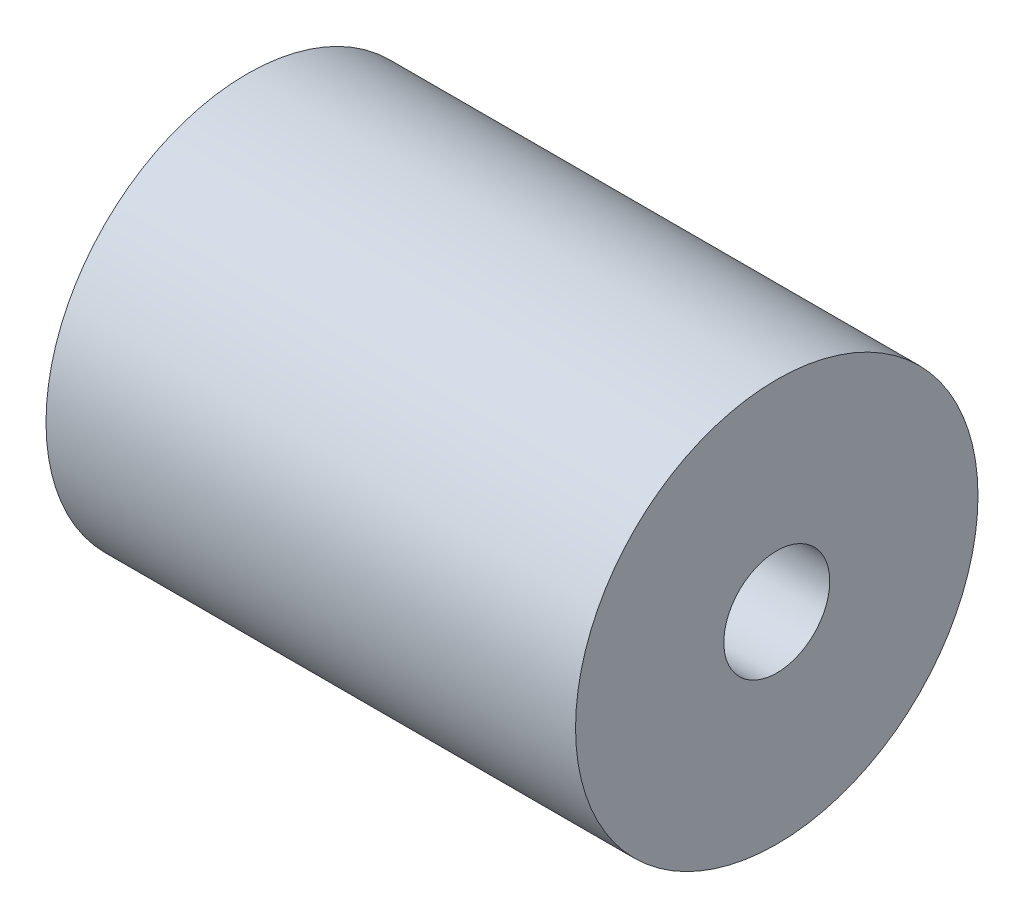
ISO-10303-21;
HEADER;
FILE_DESCRIPTION(('STEP AP214'),'2;1');
FILE_NAME('part.step','',(''),(''),'','','');
FILE_SCHEMA(('AUTOMOTIVE_DESIGN { 1 0 10303 214 1 1 1 1 }'));
ENDSEC;
DATA;
#1=APPLICATION_CONTEXT('core data for automotive mechanical design processes');
#2=APPLICATION_PROTOCOL_DEFINITION('international standard','automotive_design',2000,#1);
#3=PRODUCT_CONTEXT('',#1,'mechanical');
#4=PRODUCT('Part','Part','',(#3));
#5=PRODUCT_RELATED_PRODUCT_CATEGORY('part','',(#4));
#6=PRODUCT_DEFINITION_FORMATION('','',#4);
#7=PRODUCT_DEFINITION_CONTEXT('part definition',#1,'design');
#8=PRODUCT_DEFINITION('design','',#6,#7);
#9=PRODUCT_DEFINITION_SHAPE('','',#8);
#10=(LENGTH_UNIT() NAMED_UNIT(*) SI_UNIT(.MILLI.,.METRE.));
#11=(NAMED_UNIT(*) PLANE_ANGLE_UNIT() SI_UNIT($,.RADIAN.));
#12=(NAMED_UNIT(*) SI_UNIT($,.STERADIAN.) SOLID_ANGLE_UNIT());
#13=UNCERTAINTY_MEASURE_WITH_UNIT(LENGTH_MEASURE(1.E-05),#10,'distance_accuracy_value','');
#14=(GEOMETRIC_REPRESENTATION_CONTEXT(3) GLOBAL_UNCERTAINTY_ASSIGNED_CONTEXT((#13)) GLOBAL_UNIT_ASSIGNED_CONTEXT((#10,
#11,#12)) REPRESENTATION_CONTEXT('',''));
#15=CARTESIAN_POINT('',(0.,0.,0.));
#16=DIRECTION('',(0.,0.,1.));
#17=DIRECTION('',(1.,0.,0.));
#18=AXIS2_PLACEMENT_3D('',#15,#16,#17);
#19=CARTESIAN_POINT('',(25.,0.,30.5167577846446));
#20=DIRECTION('',(-1.,0.,0.));
#21=DIRECTION('',(0.,0.,1.));
#22=AXIS2_PLACEMENT_3D('',#19,#20,#21);
#23=CYLINDRICAL_SURFACE('',#22,9.5);
#24=CARTESIAN_POINT('',(25.,0.,30.5167577846446));
#25=DIRECTION('',(1.,0.,0.));
#26=DIRECTION('',(0.,0.,-1.));
#27=AXIS2_PLACEMENT_3D('',#24,#25,#26);
#28=CIRCLE('',#27,9.5);
#29=CARTESIAN_POINT('',(25.,0.,21.0167577846446));
#30=VERTEX_POINT('',#29);
#31=EDGE_CURVE('E10',#30,#30,#28,.T.);
#32=ORIENTED_EDGE('',*,*,#31,.F.);
#33=EDGE_LOOP('',(#32));
#34=FACE_BOUND('',#33,.T.);
#35=CARTESIAN_POINT('',(0.,0.,30.5167577846446));
#36=DIRECTION('',(1.,0.,0.));
#37=DIRECTION('',(0.,0.,-1.));
#38=AXIS2_PLACEMENT_3D('',#35,#36,#37);
#39=CIRCLE('',#38,9.5);
#40=CARTESIAN_POINT('',(0.,0.,21.0167577846446));
#41=VERTEX_POINT('',#40);
#42=EDGE_CURVE('E38',#41,#41,#39,.T.);
#43=ORIENTED_EDGE('',*,*,#42,.T.);
#44=EDGE_LOOP('',(#43));
#45=FACE_BOUND('',#44,.T.);
#46=ADVANCED_FACE('F31',(#34,#45),#23,.T.);
#47=CARTESIAN_POINT('',(25.,0.,30.5167577846446));
#48=DIRECTION('',(1.,0.,0.));
#49=DIRECTION('',(0.,0.,-1.));
#50=AXIS2_PLACEMENT_3D('',#47,#48,#49);
#51=PLANE('',#50);
#52=CARTESIAN_POINT('',(25.,0.,30.5167577846446));
#53=DIRECTION('',(1.,0.,0.));
#54=DIRECTION('',(0.,0.,-1.));
#55=AXIS2_PLACEMENT_3D('',#52,#53,#54);
#56=CIRCLE('',#55,2.5);
#57=CARTESIAN_POINT('',(25.,0.,28.0167577846446));
#58=VERTEX_POINT('',#57);
#59=EDGE_CURVE('E50',#58,#58,#56,.T.);
#60=ORIENTED_EDGE('',*,*,#59,.F.);
#61=EDGE_LOOP('',(#60));
#62=FACE_BOUND('',#61,.T.);
#63=ORIENTED_EDGE('',*,*,#31,.T.);
#64=EDGE_LOOP('',(#63));
#65=FACE_BOUND('',#64,.T.);
#66=ADVANCED_FACE('F74',(#62,#65),#51,.T.);
#67=CARTESIAN_POINT('',(0.,0.,30.5167577846446));
#68=DIRECTION('',(1.,0.,0.));
#69=DIRECTION('',(0.,0.,-1.));
#70=AXIS2_PLACEMENT_3D('',#67,#68,#69);
#71=PLANE('',#70);
#72=CARTESIAN_POINT('',(0.,0.,30.5167577846446));
#73=DIRECTION('',(-1.,0.,0.));
#74=DIRECTION('',(0.,0.,1.));
#75=AXIS2_PLACEMENT_3D('',#72,#73,#74);
#76=CIRCLE('',#75,4.00000000000001);
#77=CARTESIAN_POINT('',(0.,0.,34.5167577846446));
#78=VERTEX_POINT('',#77);
#79=EDGE_CURVE('E45',#78,#78,#76,.T.);
#80=ORIENTED_EDGE('',*,*,#79,.F.);
#81=EDGE_LOOP('',(#80));
#82=FACE_BOUND('',#81,.T.);
#83=ORIENTED_EDGE('',*,*,#42,.F.);
#84=EDGE_LOOP('',(#83));
#85=FACE_BOUND('',#84,.T.);
#86=ADVANCED_FACE('F68',(#82,#85),#71,.F.);
#87=CARTESIAN_POINT('',(18.,0.,30.5167577846446));
#88=DIRECTION('',(-1.,0.,0.));
#89=DIRECTION('',(0.,0.,1.));
#90=AXIS2_PLACEMENT_3D('',#87,#88,#89);
#91=CYLINDRICAL_SURFACE('',#90,4.00000000000001);
#92=CARTESIAN_POINT('',(18.,0.,30.5167577846446));
#93=DIRECTION('',(-1.,0.,0.));
#94=DIRECTION('',(0.,0.,1.));
#95=AXIS2_PLACEMENT_3D('',#92,#93,#94);
#96=CIRCLE('',#95,4.00000000000001);
#97=CARTESIAN_POINT('',(18.,0.,34.5167577846446));
#98=VERTEX_POINT('',#97);
#99=EDGE_CURVE('E43',#98,#98,#96,.T.);
#100=ORIENTED_EDGE('',*,*,#99,.F.);
#101=EDGE_LOOP('',(#100));
#102=FACE_BOUND('',#101,.T.);
#103=ORIENTED_EDGE('',*,*,#79,.T.);
#104=EDGE_LOOP('',(#103));
#105=FACE_BOUND('',#104,.T.);
#106=ADVANCED_FACE('F62',(#102,#105),#91,.F.);
#107=CARTESIAN_POINT('',(18.,0.,30.5167577846446));
#108=DIRECTION('',(-1.,0.,0.));
#109=DIRECTION('',(0.,0.,1.));
#110=AXIS2_PLACEMENT_3D('',#107,#108,#109);
#111=PLANE('',#110);
#112=CARTESIAN_POINT('',(18.,0.,30.5167577846446));
#113=DIRECTION('',(-1.,0.,0.));
#114=DIRECTION('',(0.,0.,1.));
#115=AXIS2_PLACEMENT_3D('',#112,#113,#114);
#116=CIRCLE('',#115,2.5);
#117=CARTESIAN_POINT('',(18.,0.,33.0167577846446));
#118=VERTEX_POINT('',#117);
#119=EDGE_CURVE('E34',#118,#118,#116,.T.);
#120=ORIENTED_EDGE('',*,*,#119,.F.);
#121=EDGE_LOOP('',(#120));
#122=FACE_BOUND('',#121,.T.);
#123=ORIENTED_EDGE('',*,*,#99,.T.);
#124=EDGE_LOOP('',(#123));
#125=FACE_BOUND('',#124,.T.);
#126=ADVANCED_FACE('F59',(#122,#125),#111,.T.);
#127=CARTESIAN_POINT('',(7.,0.,30.5167577846446));
#128=DIRECTION('',(1.,0.,0.));
#129=DIRECTION('',(0.,0.,-1.));
#130=AXIS2_PLACEMENT_3D('',#127,#128,#129);
#131=CYLINDRICAL_SURFACE('',#130,2.5);
#132=ORIENTED_EDGE('',*,*,#119,.T.);
#133=EDGE_LOOP('',(#132));
#134=FACE_BOUND('',#133,.T.);
#135=ORIENTED_EDGE('',*,*,#59,.T.);
#136=EDGE_LOOP('',(#135));
#137=FACE_BOUND('',#136,.T.);
#138=ADVANCED_FACE('F57',(#134,#137),#131,.F.);
#139=CLOSED_SHELL('',(#46,#66,#86,#106,#126,#138));
#140=MANIFOLD_SOLID_BREP('B2',#139);
#141=ADVANCED_BREP_SHAPE_REPRESENTATION('',(#18,#140),#14);
#142=SHAPE_DEFINITION_REPRESENTATION(#9,#141);
ENDSEC;
END-ISO-10303-21;
